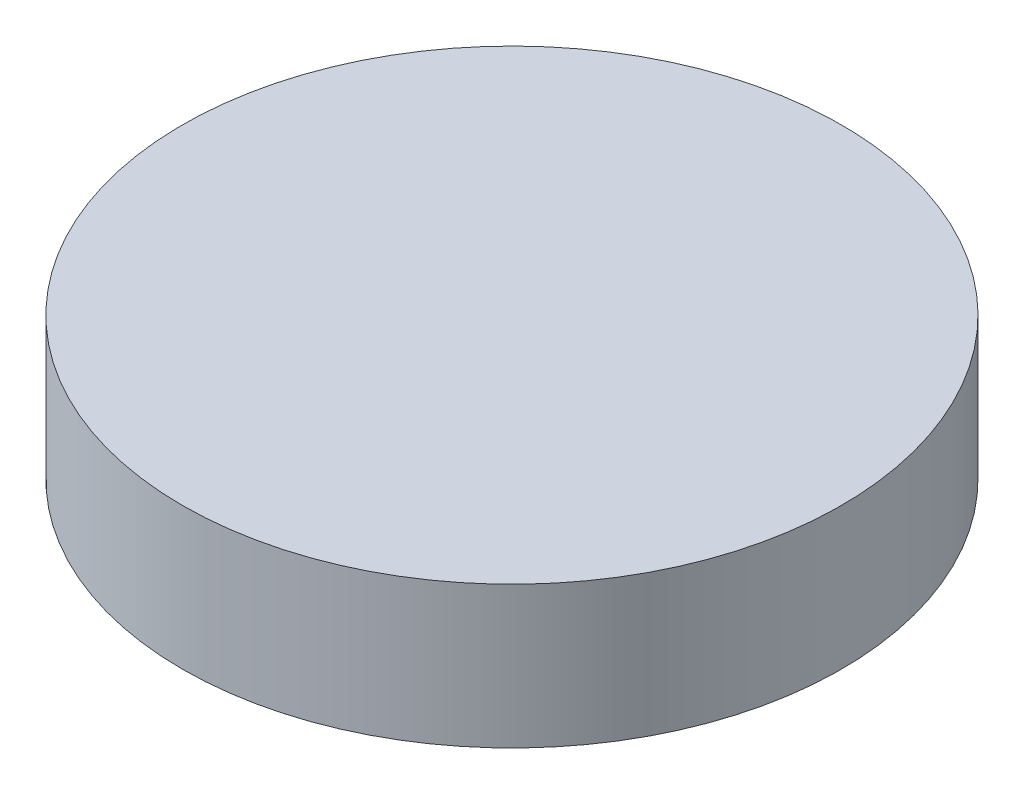
ISO-10303-21;
HEADER;
FILE_DESCRIPTION(('STEP AP214'),'2;1');
FILE_NAME('part.step','',(''),(''),'','','');
FILE_SCHEMA(('AUTOMOTIVE_DESIGN { 1 0 10303 214 1 1 1 1 }'));
ENDSEC;
DATA;
#1=APPLICATION_CONTEXT('core data for automotive mechanical design processes');
#2=APPLICATION_PROTOCOL_DEFINITION('international standard','automotive_design',2000,#1);
#3=PRODUCT_CONTEXT('',#1,'mechanical');
#4=PRODUCT('Part','Part','',(#3));
#5=PRODUCT_RELATED_PRODUCT_CATEGORY('part','',(#4));
#6=PRODUCT_DEFINITION_FORMATION('','',#4);
#7=PRODUCT_DEFINITION_CONTEXT('part definition',#1,'design');
#8=PRODUCT_DEFINITION('design','',#6,#7);
#9=PRODUCT_DEFINITION_SHAPE('','',#8);
#10=(LENGTH_UNIT() NAMED_UNIT(*) SI_UNIT(.MILLI.,.METRE.));
#11=(NAMED_UNIT(*) PLANE_ANGLE_UNIT() SI_UNIT($,.RADIAN.));
#12=(NAMED_UNIT(*) SI_UNIT($,.STERADIAN.) SOLID_ANGLE_UNIT());
#13=UNCERTAINTY_MEASURE_WITH_UNIT(LENGTH_MEASURE(1.E-05),#10,'distance_accuracy_value','');
#14=(GEOMETRIC_REPRESENTATION_CONTEXT(3) GLOBAL_UNCERTAINTY_ASSIGNED_CONTEXT((#13)) GLOBAL_UNIT_ASSIGNED_CONTEXT((#10,
#11,#12)) REPRESENTATION_CONTEXT('',''));
#15=CARTESIAN_POINT('',(0.,0.,0.));
#16=DIRECTION('',(0.,0.,1.));
#17=DIRECTION('',(1.,0.,0.));
#18=AXIS2_PLACEMENT_3D('',#15,#16,#17);
#19=CARTESIAN_POINT('',(0.,17.,0.));
#20=DIRECTION('',(0.,-1.,0.));
#21=DIRECTION('',(0.,0.,-1.));
#22=AXIS2_PLACEMENT_3D('',#19,#20,#21);
#23=CYLINDRICAL_SURFACE('',#22,39.5);
#24=CARTESIAN_POINT('',(0.,17.,0.));
#25=DIRECTION('',(0.,1.,0.));
#26=DIRECTION('',(0.,0.,1.));
#27=AXIS2_PLACEMENT_3D('',#24,#25,#26);
#28=CIRCLE('',#27,39.5);
#29=CARTESIAN_POINT('',(0.,17.,39.5));
#30=VERTEX_POINT('',#29);
#31=EDGE_CURVE('E10',#30,#30,#28,.T.);
#32=ORIENTED_EDGE('',*,*,#31,.F.);
#33=EDGE_LOOP('',(#32));
#34=FACE_BOUND('',#33,.T.);
#35=CARTESIAN_POINT('',(0.,0.,0.));
#36=DIRECTION('',(0.,1.,0.));
#37=DIRECTION('',(0.,0.,1.));
#38=AXIS2_PLACEMENT_3D('',#35,#36,#37);
#39=CIRCLE('',#38,39.5);
#40=CARTESIAN_POINT('',(0.,0.,39.5));
#41=VERTEX_POINT('',#40);
#42=EDGE_CURVE('E34',#41,#41,#39,.T.);
#43=ORIENTED_EDGE('',*,*,#42,.T.);
#44=EDGE_LOOP('',(#43));
#45=FACE_BOUND('',#44,.T.);
#46=ADVANCED_FACE('F31',(#34,#45),#23,.T.);
#47=CARTESIAN_POINT('',(0.,17.,0.));
#48=DIRECTION('',(0.,1.,0.));
#49=DIRECTION('',(0.,0.,1.));
#50=AXIS2_PLACEMENT_3D('',#47,#48,#49);
#51=PLANE('',#50);
#52=ORIENTED_EDGE('',*,*,#31,.T.);
#53=EDGE_LOOP('',(#52));
#54=FACE_BOUND('',#53,.T.);
#55=ADVANCED_FACE('F46',(#54),#51,.T.);
#56=CARTESIAN_POINT('',(0.,0.,0.));
#57=DIRECTION('',(0.,1.,0.));
#58=DIRECTION('',(0.,0.,1.));
#59=AXIS2_PLACEMENT_3D('',#56,#57,#58);
#60=PLANE('',#59);
#61=ORIENTED_EDGE('',*,*,#42,.F.);
#62=EDGE_LOOP('',(#61));
#63=FACE_BOUND('',#62,.T.);
#64=ADVANCED_FACE('F44',(#63),#60,.F.);
#65=CLOSED_SHELL('',(#46,#55,#64));
#66=MANIFOLD_SOLID_BREP('B2',#65);
#67=ADVANCED_BREP_SHAPE_REPRESENTATION('',(#18,#66),#14);
#68=SHAPE_DEFINITION_REPRESENTATION(#9,#67);
ENDSEC;
END-ISO-10303-21;
